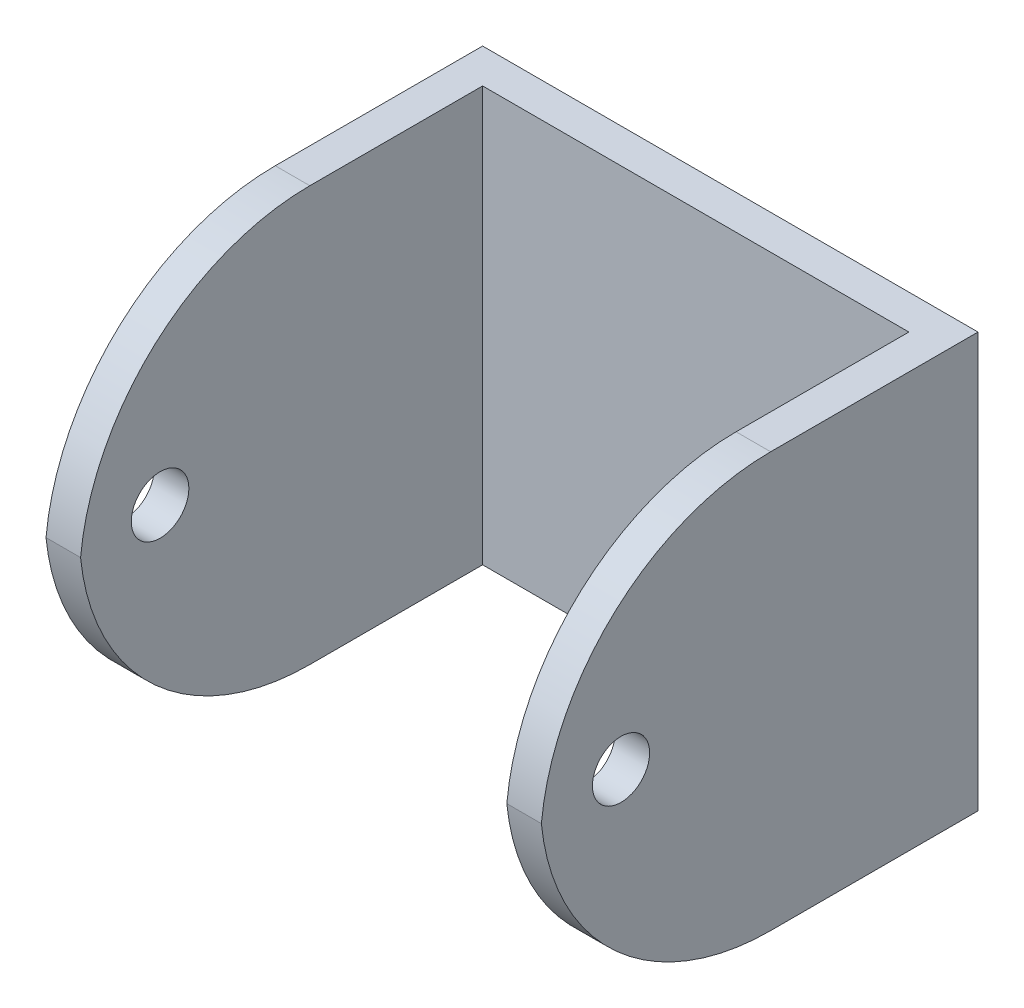
ISO-10303-21;
HEADER;
FILE_DESCRIPTION(('STEP AP214'),'2;1');
FILE_NAME('part.step','',(''),(''),'','','');
FILE_SCHEMA(('AUTOMOTIVE_DESIGN { 1 0 10303 214 1 1 1 1 }'));
ENDSEC;
DATA;
#1=APPLICATION_CONTEXT('core data for automotive mechanical design processes');
#2=APPLICATION_PROTOCOL_DEFINITION('international standard','automotive_design',2000,#1);
#3=PRODUCT_CONTEXT('',#1,'mechanical');
#4=PRODUCT('Part','Part','',(#3));
#5=PRODUCT_RELATED_PRODUCT_CATEGORY('part','',(#4));
#6=PRODUCT_DEFINITION_FORMATION('','',#4);
#7=PRODUCT_DEFINITION_CONTEXT('part definition',#1,'design');
#8=PRODUCT_DEFINITION('design','',#6,#7);
#9=PRODUCT_DEFINITION_SHAPE('','',#8);
#10=(LENGTH_UNIT() NAMED_UNIT(*) SI_UNIT(.MILLI.,.METRE.));
#11=(NAMED_UNIT(*) PLANE_ANGLE_UNIT() SI_UNIT($,.RADIAN.));
#12=(NAMED_UNIT(*) SI_UNIT($,.STERADIAN.) SOLID_ANGLE_UNIT());
#13=UNCERTAINTY_MEASURE_WITH_UNIT(LENGTH_MEASURE(1.E-05),#10,'distance_accuracy_value','');
#14=(GEOMETRIC_REPRESENTATION_CONTEXT(3) GLOBAL_UNCERTAINTY_ASSIGNED_CONTEXT((#13)) GLOBAL_UNIT_ASSIGNED_CONTEXT((#10,
#11,#12)) REPRESENTATION_CONTEXT('',''));
#15=CARTESIAN_POINT('',(0.,0.,0.));
#16=DIRECTION('',(0.,0.,1.));
#17=DIRECTION('',(1.,0.,0.));
#18=AXIS2_PLACEMENT_3D('',#15,#16,#17);
#19=CARTESIAN_POINT('',(-74.0142461928934,-4.40042301184432,3.));
#20=DIRECTION('',(0.,0.,1.));
#21=DIRECTION('',(1.,0.,0.));
#22=AXIS2_PLACEMENT_3D('',#19,#20,#21);
#23=PLANE('',#22);
#24=DIRECTION('',(1.,0.,0.));
#25=VECTOR('',#24,1.);
#26=CARTESIAN_POINT('',(-74.0142461928934,-4.40042301184432,3.));
#27=LINE('',#26,#25);
#28=CARTESIAN_POINT('',(-71.0142461928934,-4.40042301184432,3.));
#29=VERTEX_POINT('',#28);
#30=CARTESIAN_POINT('',(-34.0142461928934,-4.40042301184432,3.));
#31=VERTEX_POINT('',#30);
#32=EDGE_CURVE('E124',#29,#31,#27,.T.);
#33=ORIENTED_EDGE('',*,*,#32,.T.);
#34=DIRECTION('',(0.,-1.,0.));
#35=VECTOR('',#34,1.);
#36=CARTESIAN_POINT('',(-34.0142461928934,31.5995769881557,3.));
#37=LINE('',#36,#35);
#38=CARTESIAN_POINT('',(-34.0142461928934,31.5995769881557,3.));
#39=VERTEX_POINT('',#38);
#40=EDGE_CURVE('E109',#39,#31,#37,.T.);
#41=ORIENTED_EDGE('',*,*,#40,.F.);
#42=DIRECTION('',(-1.,0.,0.));
#43=VECTOR('',#42,1.);
#44=CARTESIAN_POINT('',(-74.0142461928934,31.5995769881557,3.));
#45=LINE('',#44,#43);
#46=CARTESIAN_POINT('',(-71.0142461928934,31.5995769881557,3.));
#47=VERTEX_POINT('',#46);
#48=EDGE_CURVE('E116',#39,#47,#45,.T.);
#49=ORIENTED_EDGE('',*,*,#48,.T.);
#50=DIRECTION('',(0.,1.,0.));
#51=VECTOR('',#50,1.);
#52=CARTESIAN_POINT('',(-71.0142461928934,31.5995769881557,3.));
#53=LINE('',#52,#51);
#54=EDGE_CURVE('E140',#29,#47,#53,.T.);
#55=ORIENTED_EDGE('',*,*,#54,.F.);
#56=EDGE_LOOP('',(#33,#41,#49,#55));
#57=FACE_BOUND('',#56,.T.);
#58=ADVANCED_FACE('F33',(#57),#23,.T.);
#59=CARTESIAN_POINT('',(-74.0142461928934,31.5995769881557,3.));
#60=DIRECTION('',(1.,0.,0.));
#61=DIRECTION('',(0.,1.,0.));
#62=AXIS2_PLACEMENT_3D('',#59,#60,#61);
#63=PLANE('',#62);
#64=CARTESIAN_POINT('',(-74.0142461928934,14.0995769881557,31.));
#65=DIRECTION('',(-1.,0.,0.));
#66=DIRECTION('',(0.,-1.,0.));
#67=AXIS2_PLACEMENT_3D('',#64,#65,#66);
#68=CIRCLE('',#67,2.49999999999999);
#69=CARTESIAN_POINT('',(-74.0142461928934,11.5995769881557,31.));
#70=VERTEX_POINT('',#69);
#71=EDGE_CURVE('E136',#70,#70,#68,.T.);
#72=ORIENTED_EDGE('',*,*,#71,.F.);
#73=EDGE_LOOP('',(#72));
#74=FACE_BOUND('',#73,.T.);
#75=DIRECTION('',(0.,0.,-1.));
#76=VECTOR('',#75,1.);
#77=CARTESIAN_POINT('',(-74.0142461928934,-4.40042301184432,3.));
#78=LINE('',#77,#76);
#79=CARTESIAN_POINT('',(-74.0142461928934,-4.40042301184432,18.));
#80=VERTEX_POINT('',#79);
#81=CARTESIAN_POINT('',(-74.0142461928934,-4.40042301184432,0.));
#82=VERTEX_POINT('',#81);
#83=EDGE_CURVE('E154',#80,#82,#78,.T.);
#84=ORIENTED_EDGE('',*,*,#83,.F.);
#85=CARTESIAN_POINT('',(-74.0142461928934,15.5995769881557,18.));
#86=DIRECTION('',(1.,0.,0.));
#87=DIRECTION('',(0.,1.,0.));
#88=AXIS2_PLACEMENT_3D('',#85,#86,#87);
#89=CIRCLE('',#88,20.);
#90=CARTESIAN_POINT('',(-74.0142461928934,13.5995769881557,37.8997487421324));
#91=VERTEX_POINT('',#90);
#92=EDGE_CURVE('E169',#80,#91,#89,.F.);
#93=ORIENTED_EDGE('',*,*,#92,.T.);
#94=CARTESIAN_POINT('',(-74.0142461928934,11.5995769881557,18.));
#95=DIRECTION('',(1.,0.,0.));
#96=DIRECTION('',(0.,1.,0.));
#97=AXIS2_PLACEMENT_3D('',#94,#95,#96);
#98=CIRCLE('',#97,20.);
#99=CARTESIAN_POINT('',(-74.0142461928934,31.5995769881557,18.));
#100=VERTEX_POINT('',#99);
#101=EDGE_CURVE('E167',#91,#100,#98,.F.);
#102=ORIENTED_EDGE('',*,*,#101,.T.);
#103=DIRECTION('',(0.,0.,-1.));
#104=VECTOR('',#103,1.);
#105=CARTESIAN_POINT('',(-74.0142461928934,31.5995769881557,3.));
#106=LINE('',#105,#104);
#107=CARTESIAN_POINT('',(-74.0142461928934,31.5995769881557,0.));
#108=VERTEX_POINT('',#107);
#109=EDGE_CURVE('E123',#100,#108,#106,.T.);
#110=ORIENTED_EDGE('',*,*,#109,.T.);
#111=DIRECTION('',(0.,-1.,0.));
#112=VECTOR('',#111,1.);
#113=CARTESIAN_POINT('',(-74.0142461928934,31.5995769881557,0.));
#114=LINE('',#113,#112);
#115=EDGE_CURVE('E145',#108,#82,#114,.T.);
#116=ORIENTED_EDGE('',*,*,#115,.T.);
#117=EDGE_LOOP('',(#84,#93,#102,#110,#116));
#118=FACE_BOUND('',#117,.T.);
#119=ADVANCED_FACE('F213',(#74,#118),#63,.F.);
#120=CARTESIAN_POINT('',(-74.0142461928934,-4.40042301184432,3.));
#121=DIRECTION('',(0.,1.,0.));
#122=DIRECTION('',(0.,0.,1.));
#123=AXIS2_PLACEMENT_3D('',#120,#121,#122);
#124=PLANE('',#123);
#125=DIRECTION('',(0.,0.,-1.));
#126=VECTOR('',#125,1.);
#127=CARTESIAN_POINT('',(-31.0142461928934,-4.40042301184432,3.));
#128=LINE('',#127,#126);
#129=CARTESIAN_POINT('',(-31.0142461928934,-4.40042301184432,18.));
#130=VERTEX_POINT('',#129);
#131=CARTESIAN_POINT('',(-31.0142461928934,-4.40042301184432,0.));
#132=VERTEX_POINT('',#131);
#133=EDGE_CURVE('E186',#130,#132,#128,.T.);
#134=ORIENTED_EDGE('',*,*,#133,.F.);
#135=DIRECTION('',(1.,0.,0.));
#136=VECTOR('',#135,1.);
#137=CARTESIAN_POINT('',(-74.0142461928934,-4.40042301184432,18.));
#138=LINE('',#137,#136);
#139=CARTESIAN_POINT('',(-34.0142461928934,-4.40042301184432,18.));
#140=VERTEX_POINT('',#139);
#141=EDGE_CURVE('E177',#130,#140,#138,.F.);
#142=ORIENTED_EDGE('',*,*,#141,.T.);
#143=DIRECTION('',(0.,0.,-1.));
#144=VECTOR('',#143,1.);
#145=CARTESIAN_POINT('',(-34.0142461928934,-4.40042301184432,38.));
#146=LINE('',#145,#144);
#147=EDGE_CURVE('E113',#140,#31,#146,.T.);
#148=ORIENTED_EDGE('',*,*,#147,.T.);
#149=ORIENTED_EDGE('',*,*,#32,.F.);
#150=DIRECTION('',(0.,0.,-1.));
#151=VECTOR('',#150,1.);
#152=CARTESIAN_POINT('',(-71.0142461928934,-4.40042301184432,38.));
#153=LINE('',#152,#151);
#154=CARTESIAN_POINT('',(-71.0142461928934,-4.40042301184432,18.));
#155=VERTEX_POINT('',#154);
#156=EDGE_CURVE('E143',#155,#29,#153,.T.);
#157=ORIENTED_EDGE('',*,*,#156,.F.);
#158=DIRECTION('',(1.,0.,0.));
#159=VECTOR('',#158,1.);
#160=CARTESIAN_POINT('',(-74.0142461928934,-4.40042301184432,18.));
#161=LINE('',#160,#159);
#162=EDGE_CURVE('E158',#155,#80,#161,.F.);
#163=ORIENTED_EDGE('',*,*,#162,.T.);
#164=ORIENTED_EDGE('',*,*,#83,.T.);
#165=DIRECTION('',(1.,0.,0.));
#166=VECTOR('',#165,1.);
#167=CARTESIAN_POINT('',(-74.0142461928934,-4.40042301184432,0.));
#168=LINE('',#167,#166);
#169=EDGE_CURVE('E257',#82,#132,#168,.T.);
#170=ORIENTED_EDGE('',*,*,#169,.T.);
#171=EDGE_LOOP('',(#134,#142,#148,#149,#157,#163,#164,#170));
#172=FACE_BOUND('',#171,.T.);
#173=ADVANCED_FACE('F184',(#172),#124,.F.);
#174=CARTESIAN_POINT('',(-31.0142461928934,31.5995769881557,3.));
#175=DIRECTION('',(-1.,0.,0.));
#176=DIRECTION('',(0.,0.,1.));
#177=AXIS2_PLACEMENT_3D('',#174,#175,#176);
#178=PLANE('',#177);
#179=CARTESIAN_POINT('',(-31.0142461928934,14.2170342769596,30.985935606197));
#180=DIRECTION('',(-1.,0.,0.));
#181=DIRECTION('',(0.,0.,1.));
#182=AXIS2_PLACEMENT_3D('',#179,#180,#181);
#183=CIRCLE('',#182,2.48261524146622);
#184=CARTESIAN_POINT('',(-31.0142461928934,14.2170342769596,33.4685508476632));
#185=VERTEX_POINT('',#184);
#186=EDGE_CURVE('E128',#185,#185,#183,.T.);
#187=ORIENTED_EDGE('',*,*,#186,.T.);
#188=EDGE_LOOP('',(#187));
#189=FACE_BOUND('',#188,.T.);
#190=CARTESIAN_POINT('',(-31.0142461928934,11.5995769881557,18.));
#191=DIRECTION('',(-1.,0.,0.));
#192=DIRECTION('',(0.,0.,1.));
#193=AXIS2_PLACEMENT_3D('',#190,#191,#192);
#194=CIRCLE('',#193,20.);
#195=CARTESIAN_POINT('',(-31.0142461928934,31.5995769881557,18.));
#196=VERTEX_POINT('',#195);
#197=CARTESIAN_POINT('',(-31.0142461928934,13.5995769881557,37.8997487421324));
#198=VERTEX_POINT('',#197);
#199=EDGE_CURVE('E171',#196,#198,#194,.F.);
#200=ORIENTED_EDGE('',*,*,#199,.T.);
#201=CARTESIAN_POINT('',(-31.0142461928934,15.5995769881557,18.));
#202=DIRECTION('',(-1.,0.,0.));
#203=DIRECTION('',(0.,0.,1.));
#204=AXIS2_PLACEMENT_3D('',#201,#202,#203);
#205=CIRCLE('',#204,20.);
#206=EDGE_CURVE('E175',#198,#130,#205,.F.);
#207=ORIENTED_EDGE('',*,*,#206,.T.);
#208=ORIENTED_EDGE('',*,*,#133,.T.);
#209=DIRECTION('',(0.,1.,0.));
#210=VECTOR('',#209,1.);
#211=CARTESIAN_POINT('',(-31.0142461928934,31.5995769881557,0.));
#212=LINE('',#211,#210);
#213=CARTESIAN_POINT('',(-31.0142461928934,31.5995769881557,0.));
#214=VERTEX_POINT('',#213);
#215=EDGE_CURVE('E250',#132,#214,#212,.T.);
#216=ORIENTED_EDGE('',*,*,#215,.T.);
#217=DIRECTION('',(0.,0.,-1.));
#218=VECTOR('',#217,1.);
#219=CARTESIAN_POINT('',(-31.0142461928934,31.5995769881557,3.));
#220=LINE('',#219,#218);
#221=EDGE_CURVE('E246',#196,#214,#220,.T.);
#222=ORIENTED_EDGE('',*,*,#221,.F.);
#223=EDGE_LOOP('',(#200,#207,#208,#216,#222));
#224=FACE_BOUND('',#223,.T.);
#225=ADVANCED_FACE('F229',(#189,#224),#178,.F.);
#226=CARTESIAN_POINT('',(-74.0142461928934,31.5995769881557,3.));
#227=DIRECTION('',(0.,-1.,0.));
#228=DIRECTION('',(0.,0.,-1.));
#229=AXIS2_PLACEMENT_3D('',#226,#227,#228);
#230=PLANE('',#229);
#231=DIRECTION('',(0.,0.,-1.));
#232=VECTOR('',#231,1.);
#233=CARTESIAN_POINT('',(-34.0142461928934,31.5995769881557,38.));
#234=LINE('',#233,#232);
#235=CARTESIAN_POINT('',(-34.0142461928934,31.5995769881557,18.));
#236=VERTEX_POINT('',#235);
#237=EDGE_CURVE('E105',#236,#39,#234,.T.);
#238=ORIENTED_EDGE('',*,*,#237,.F.);
#239=DIRECTION('',(-1.,0.,0.));
#240=VECTOR('',#239,1.);
#241=CARTESIAN_POINT('',(-74.0142461928934,31.5995769881557,18.));
#242=LINE('',#241,#240);
#243=EDGE_CURVE('E11',#236,#196,#242,.F.);
#244=ORIENTED_EDGE('',*,*,#243,.T.);
#245=ORIENTED_EDGE('',*,*,#221,.T.);
#246=DIRECTION('',(-1.,0.,0.));
#247=VECTOR('',#246,1.);
#248=CARTESIAN_POINT('',(-74.0142461928934,31.5995769881557,0.));
#249=LINE('',#248,#247);
#250=EDGE_CURVE('E153',#214,#108,#249,.T.);
#251=ORIENTED_EDGE('',*,*,#250,.T.);
#252=ORIENTED_EDGE('',*,*,#109,.F.);
#253=DIRECTION('',(-1.,0.,0.));
#254=VECTOR('',#253,1.);
#255=CARTESIAN_POINT('',(-71.0142461928934,31.5995769881557,18.));
#256=LINE('',#255,#254);
#257=CARTESIAN_POINT('',(-71.0142461928934,31.5995769881557,18.));
#258=VERTEX_POINT('',#257);
#259=EDGE_CURVE('E161',#100,#258,#256,.F.);
#260=ORIENTED_EDGE('',*,*,#259,.T.);
#261=DIRECTION('',(0.,0.,-1.));
#262=VECTOR('',#261,1.);
#263=CARTESIAN_POINT('',(-71.0142461928934,31.5995769881557,38.));
#264=LINE('',#263,#262);
#265=EDGE_CURVE('E119',#258,#47,#264,.T.);
#266=ORIENTED_EDGE('',*,*,#265,.T.);
#267=ORIENTED_EDGE('',*,*,#48,.F.);
#268=EDGE_LOOP('',(#238,#244,#245,#251,#252,#260,#266,#267));
#269=FACE_BOUND('',#268,.T.);
#270=ADVANCED_FACE('F117',(#269),#230,.F.);
#271=CARTESIAN_POINT('',(-74.0142461928934,-4.40042301184432,0.));
#272=DIRECTION('',(0.,0.,1.));
#273=DIRECTION('',(1.,0.,0.));
#274=AXIS2_PLACEMENT_3D('',#271,#272,#273);
#275=PLANE('',#274);
#276=ORIENTED_EDGE('',*,*,#115,.F.);
#277=ORIENTED_EDGE('',*,*,#250,.F.);
#278=ORIENTED_EDGE('',*,*,#215,.F.);
#279=ORIENTED_EDGE('',*,*,#169,.F.);
#280=EDGE_LOOP('',(#276,#277,#278,#279));
#281=FACE_BOUND('',#280,.T.);
#282=ADVANCED_FACE('F223',(#281),#275,.F.);
#283=CARTESIAN_POINT('',(-71.0142461928934,31.5995769881557,38.));
#284=DIRECTION('',(-1.,0.,0.));
#285=DIRECTION('',(0.,0.,1.));
#286=AXIS2_PLACEMENT_3D('',#283,#284,#285);
#287=PLANE('',#286);
#288=CARTESIAN_POINT('',(-71.0142461928934,14.0995769881557,31.));
#289=DIRECTION('',(-1.,0.,0.));
#290=DIRECTION('',(0.,0.,1.));
#291=AXIS2_PLACEMENT_3D('',#288,#289,#290);
#292=CIRCLE('',#291,2.49999999999999);
#293=CARTESIAN_POINT('',(-71.0142461928934,11.5995769881557,31.));
#294=VERTEX_POINT('',#293);
#295=EDGE_CURVE('E139',#294,#294,#292,.T.);
#296=ORIENTED_EDGE('',*,*,#295,.T.);
#297=EDGE_LOOP('',(#296));
#298=FACE_BOUND('',#297,.T.);
#299=CARTESIAN_POINT('',(-71.0142461928934,11.5995769881557,18.));
#300=DIRECTION('',(-1.,0.,0.));
#301=DIRECTION('',(0.,0.,1.));
#302=AXIS2_PLACEMENT_3D('',#299,#300,#301);
#303=CIRCLE('',#302,20.);
#304=CARTESIAN_POINT('',(-71.0142461928934,13.5995769881557,37.8997487421324));
#305=VERTEX_POINT('',#304);
#306=EDGE_CURVE('E163',#258,#305,#303,.F.);
#307=ORIENTED_EDGE('',*,*,#306,.T.);
#308=CARTESIAN_POINT('',(-71.0142461928934,15.5995769881557,18.));
#309=DIRECTION('',(-1.,0.,0.));
#310=DIRECTION('',(0.,0.,1.));
#311=AXIS2_PLACEMENT_3D('',#308,#309,#310);
#312=CIRCLE('',#311,20.);
#313=EDGE_CURVE('E165',#305,#155,#312,.F.);
#314=ORIENTED_EDGE('',*,*,#313,.T.);
#315=ORIENTED_EDGE('',*,*,#156,.T.);
#316=ORIENTED_EDGE('',*,*,#54,.T.);
#317=ORIENTED_EDGE('',*,*,#265,.F.);
#318=EDGE_LOOP('',(#307,#314,#315,#316,#317));
#319=FACE_BOUND('',#318,.T.);
#320=ADVANCED_FACE('F222',(#298,#319),#287,.F.);
#321=CARTESIAN_POINT('',(20.9857538071066,14.0995769881557,31.));
#322=DIRECTION('',(-1.,0.,0.));
#323=DIRECTION('',(0.,-1.,0.));
#324=AXIS2_PLACEMENT_3D('',#321,#322,#323);
#325=CYLINDRICAL_SURFACE('',#324,2.49999999999999);
#326=CARTESIAN_POINT('',(-74.0142461928934,11.5995769881557,31.));
#327=CARTESIAN_POINT('',(-73.9829961928934,11.5995769881557,31.));
#328=CARTESIAN_POINT('',(-73.9517461928934,11.5995769881557,31.));
#329=CARTESIAN_POINT('',(-73.8892461928934,11.5995769881557,31.));
#330=CARTESIAN_POINT('',(-73.8579961928934,11.5995769881557,31.));
#331=CARTESIAN_POINT('',(-73.7954961928934,11.5995769881557,31.));
#332=CARTESIAN_POINT('',(-73.7642461928934,11.5995769881557,31.));
#333=CARTESIAN_POINT('',(-73.7017461928934,11.5995769881557,31.));
#334=CARTESIAN_POINT('',(-73.6704961928934,11.5995769881557,31.));
#335=CARTESIAN_POINT('',(-73.6079961928934,11.5995769881557,31.));
#336=CARTESIAN_POINT('',(-73.5767461928934,11.5995769881557,31.));
#337=CARTESIAN_POINT('',(-73.5142461928934,11.5995769881557,31.));
#338=CARTESIAN_POINT('',(-73.4829961928934,11.5995769881557,31.));
#339=CARTESIAN_POINT('',(-73.4204961928934,11.5995769881557,31.));
#340=CARTESIAN_POINT('',(-73.3892461928934,11.5995769881557,31.));
#341=CARTESIAN_POINT('',(-73.3267461928934,11.5995769881557,31.));
#342=CARTESIAN_POINT('',(-73.2954961928934,11.5995769881557,31.));
#343=CARTESIAN_POINT('',(-73.2329961928934,11.5995769881557,31.));
#344=CARTESIAN_POINT('',(-73.2017461928934,11.5995769881557,31.));
#345=CARTESIAN_POINT('',(-73.1392461928934,11.5995769881557,31.));
#346=CARTESIAN_POINT('',(-73.1079961928934,11.5995769881557,31.));
#347=CARTESIAN_POINT('',(-73.0454961928934,11.5995769881557,31.));
#348=CARTESIAN_POINT('',(-73.0142461928934,11.5995769881557,31.));
#349=CARTESIAN_POINT('',(-72.9517461928934,11.5995769881557,31.));
#350=CARTESIAN_POINT('',(-72.9204961928934,11.5995769881557,31.));
#351=CARTESIAN_POINT('',(-72.8579961928934,11.5995769881557,31.));
#352=CARTESIAN_POINT('',(-72.8267461928934,11.5995769881557,31.));
#353=CARTESIAN_POINT('',(-72.7642461928934,11.5995769881557,31.));
#354=CARTESIAN_POINT('',(-72.7329961928934,11.5995769881557,31.));
#355=CARTESIAN_POINT('',(-72.6704961928934,11.5995769881557,31.));
#356=CARTESIAN_POINT('',(-72.6392461928934,11.5995769881557,31.));
#357=CARTESIAN_POINT('',(-72.5767461928934,11.5995769881557,31.));
#358=CARTESIAN_POINT('',(-72.5454961928934,11.5995769881557,31.));
#359=CARTESIAN_POINT('',(-72.4829961928934,11.5995769881557,31.));
#360=CARTESIAN_POINT('',(-72.4517461928934,11.5995769881557,31.));
#361=CARTESIAN_POINT('',(-72.3892461928934,11.5995769881557,31.));
#362=CARTESIAN_POINT('',(-72.3579961928934,11.5995769881557,31.));
#363=CARTESIAN_POINT('',(-72.2954961928934,11.5995769881557,31.));
#364=CARTESIAN_POINT('',(-72.2642461928934,11.5995769881557,31.));
#365=CARTESIAN_POINT('',(-72.2017461928934,11.5995769881557,31.));
#366=CARTESIAN_POINT('',(-72.1704961928934,11.5995769881557,31.));
#367=CARTESIAN_POINT('',(-72.1079961928934,11.5995769881557,31.));
#368=CARTESIAN_POINT('',(-72.0767461928934,11.5995769881557,31.));
#369=CARTESIAN_POINT('',(-72.0142461928934,11.5995769881557,31.));
#370=CARTESIAN_POINT('',(-71.9829961928934,11.5995769881557,31.));
#371=CARTESIAN_POINT('',(-71.9204961928934,11.5995769881557,31.));
#372=CARTESIAN_POINT('',(-71.8892461928934,11.5995769881557,31.));
#373=CARTESIAN_POINT('',(-71.8267461928934,11.5995769881557,31.));
#374=CARTESIAN_POINT('',(-71.7954961928934,11.5995769881557,31.));
#375=CARTESIAN_POINT('',(-71.7329961928934,11.5995769881557,31.));
#376=CARTESIAN_POINT('',(-71.7017461928934,11.5995769881557,31.));
#377=CARTESIAN_POINT('',(-71.6392461928934,11.5995769881557,31.));
#378=CARTESIAN_POINT('',(-71.6079961928934,11.5995769881557,31.));
#379=CARTESIAN_POINT('',(-71.5454961928934,11.5995769881557,31.));
#380=CARTESIAN_POINT('',(-71.5142461928934,11.5995769881557,31.));
#381=CARTESIAN_POINT('',(-71.4517461928934,11.5995769881557,31.));
#382=CARTESIAN_POINT('',(-71.4204961928934,11.5995769881557,31.));
#383=CARTESIAN_POINT('',(-71.3579961928934,11.5995769881557,31.));
#384=CARTESIAN_POINT('',(-71.3267461928934,11.5995769881557,31.));
#385=CARTESIAN_POINT('',(-71.2642461928934,11.5995769881557,31.));
#386=CARTESIAN_POINT('',(-71.2329961928934,11.5995769881557,31.));
#387=CARTESIAN_POINT('',(-71.1704961928934,11.5995769881557,31.));
#388=CARTESIAN_POINT('',(-71.1392461928934,11.5995769881557,31.));
#389=CARTESIAN_POINT('',(-71.0767461928934,11.5995769881557,31.));
#390=CARTESIAN_POINT('',(-71.0454961928934,11.5995769881557,31.));
#391=CARTESIAN_POINT('',(-71.0142461928934,11.5995769881557,31.));
#392=B_SPLINE_CURVE_WITH_KNOTS('',3,(#326,#327,#328,#329,#330,#331,#332,#333,#334,#335,#336,
#337,#338,#339,#340,#341,#342,#343,#344,#345,#346,#347,#348,#349,#350,#351,#352,#353,#354,#355,
#356,#357,#358,#359,#360,#361,#362,#363,#364,#365,#366,#367,#368,#369,#370,#371,#372,#373,#374,
#375,#376,#377,#378,#379,#380,#381,#382,#383,#384,#385,#386,#387,#388,#389,#390,#391),
.UNSPECIFIED.,.F.,.F.,(4,2,2,2,2,2,2,2,2,2,2,2,2,2,2,2,2,2,2,2,2,2,2,2,2,2,2,2,2,2,2,2,4),(0.,
0.0937500000000036,0.187500000000007,0.281249999999997,0.375,0.468750000000004,
0.562499999999994,0.656249999999997,0.750000000000001,0.843750000000004,0.937500000000008,
1.03125,1.125,1.21875,1.31249999999999,1.40625,1.5,1.59375,1.68750000000001,1.78125,1.875,
1.96875000000001,2.06249999999999,2.15625,2.25,2.34375000000001,2.43750000000001,2.53125,2.625,
2.71875000000001,2.8125,2.90625,3.),.UNSPECIFIED.);
#393=EDGE_CURVE('BSEAM236',#70,#294,#392,.T.);
#394=ORIENTED_EDGE('',*,*,#71,.T.);
#395=ORIENTED_EDGE('',*,*,#295,.F.);
#396=ORIENTED_EDGE('',*,*,#393,.T.);
#397=ORIENTED_EDGE('',*,*,#393,.F.);
#398=EDGE_LOOP('',(#394,#396,#395,#397));
#399=FACE_BOUND('',#398,.T.);
#400=ADVANCED_FACE('F236',(#399),#325,.F.);
#401=CARTESIAN_POINT('',(-74.0142461928934,11.5995769881557,18.));
#402=DIRECTION('',(1.,0.,0.));
#403=DIRECTION('',(0.,0.,-1.));
#404=AXIS2_PLACEMENT_3D('',#401,#402,#403);
#405=CYLINDRICAL_SURFACE('',#404,20.);
#406=ORIENTED_EDGE('',*,*,#259,.F.);
#407=ORIENTED_EDGE('',*,*,#101,.F.);
#408=DIRECTION('',(1.,0.,0.));
#409=VECTOR('',#408,1.);
#410=CARTESIAN_POINT('',(-72.5142461928934,13.5995769881557,37.8997487421324));
#411=LINE('',#410,#409);
#412=EDGE_CURVE('E112',#305,#91,#411,.F.);
#413=ORIENTED_EDGE('',*,*,#412,.F.);
#414=ORIENTED_EDGE('',*,*,#306,.F.);
#415=EDGE_LOOP('',(#406,#407,#413,#414));
#416=FACE_BOUND('',#415,.T.);
#417=ADVANCED_FACE('F208',(#416),#405,.T.);
#418=CARTESIAN_POINT('',(-74.0142461928934,15.5995769881557,18.));
#419=DIRECTION('',(-1.,0.,0.));
#420=DIRECTION('',(0.,0.,1.));
#421=AXIS2_PLACEMENT_3D('',#418,#419,#420);
#422=CYLINDRICAL_SURFACE('',#421,20.);
#423=ORIENTED_EDGE('',*,*,#92,.F.);
#424=ORIENTED_EDGE('',*,*,#162,.F.);
#425=ORIENTED_EDGE('',*,*,#313,.F.);
#426=ORIENTED_EDGE('',*,*,#412,.T.);
#427=EDGE_LOOP('',(#423,#424,#425,#426));
#428=FACE_BOUND('',#427,.T.);
#429=ADVANCED_FACE('F201',(#428),#422,.T.);
#430=CARTESIAN_POINT('',(-34.0142461928934,31.5995769881557,38.));
#431=DIRECTION('',(1.,0.,0.));
#432=DIRECTION('',(0.,0.,-1.));
#433=AXIS2_PLACEMENT_3D('',#430,#431,#432);
#434=PLANE('',#433);
#435=CARTESIAN_POINT('',(-34.0142461928934,14.2170342769596,30.985935606197));
#436=DIRECTION('',(-1.,0.,0.));
#437=DIRECTION('',(0.,0.,1.));
#438=AXIS2_PLACEMENT_3D('',#435,#436,#437);
#439=CIRCLE('',#438,2.48261524146622);
#440=CARTESIAN_POINT('',(-34.0142461928934,14.2170342769596,33.4685508476632));
#441=VERTEX_POINT('',#440);
#442=EDGE_CURVE('E132',#441,#441,#439,.T.);
#443=ORIENTED_EDGE('',*,*,#442,.F.);
#444=EDGE_LOOP('',(#443));
#445=FACE_BOUND('',#444,.T.);
#446=ORIENTED_EDGE('',*,*,#147,.F.);
#447=CARTESIAN_POINT('',(-34.0142461928934,15.5995769881557,18.));
#448=DIRECTION('',(1.,0.,0.));
#449=DIRECTION('',(0.,0.,-1.));
#450=AXIS2_PLACEMENT_3D('',#447,#448,#449);
#451=CIRCLE('',#450,20.);
#452=CARTESIAN_POINT('',(-34.0142461928934,13.5995769881557,37.8997487421324));
#453=VERTEX_POINT('',#452);
#454=EDGE_CURVE('E42',#140,#453,#451,.F.);
#455=ORIENTED_EDGE('',*,*,#454,.T.);
#456=CARTESIAN_POINT('',(-34.0142461928934,11.5995769881557,18.));
#457=DIRECTION('',(1.,0.,0.));
#458=DIRECTION('',(0.,0.,-1.));
#459=AXIS2_PLACEMENT_3D('',#456,#457,#458);
#460=CIRCLE('',#459,20.);
#461=EDGE_CURVE('E52',#453,#236,#460,.F.);
#462=ORIENTED_EDGE('',*,*,#461,.T.);
#463=ORIENTED_EDGE('',*,*,#237,.T.);
#464=ORIENTED_EDGE('',*,*,#40,.T.);
#465=EDGE_LOOP('',(#446,#455,#462,#463,#464));
#466=FACE_BOUND('',#465,.T.);
#467=ADVANCED_FACE('F107',(#445,#466),#434,.F.);
#468=CARTESIAN_POINT('',(0.985753807106631,14.2170342769596,30.985935606197));
#469=DIRECTION('',(-1.,0.,0.));
#470=DIRECTION('',(0.,0.,1.));
#471=AXIS2_PLACEMENT_3D('',#468,#469,#470);
#472=CYLINDRICAL_SURFACE('',#471,2.48261524146622);
#473=ORIENTED_EDGE('',*,*,#442,.T.);
#474=EDGE_LOOP('',(#473));
#475=FACE_BOUND('',#474,.T.);
#476=ORIENTED_EDGE('',*,*,#186,.F.);
#477=EDGE_LOOP('',(#476));
#478=FACE_BOUND('',#477,.T.);
#479=ADVANCED_FACE('F197',(#475,#478),#472,.F.);
#480=CARTESIAN_POINT('',(-31.0142461928934,11.5995769881557,18.));
#481=DIRECTION('',(-1.,0.,0.));
#482=DIRECTION('',(0.,0.,1.));
#483=AXIS2_PLACEMENT_3D('',#480,#481,#482);
#484=CYLINDRICAL_SURFACE('',#483,20.);
#485=ORIENTED_EDGE('',*,*,#243,.F.);
#486=ORIENTED_EDGE('',*,*,#461,.F.);
#487=DIRECTION('',(-1.,0.,0.));
#488=VECTOR('',#487,1.);
#489=CARTESIAN_POINT('',(-32.5142461928934,13.5995769881557,37.8997487421324));
#490=LINE('',#489,#488);
#491=EDGE_CURVE('E37',#198,#453,#490,.T.);
#492=ORIENTED_EDGE('',*,*,#491,.F.);
#493=ORIENTED_EDGE('',*,*,#199,.F.);
#494=EDGE_LOOP('',(#485,#486,#492,#493));
#495=FACE_BOUND('',#494,.T.);
#496=ADVANCED_FACE('F35',(#495),#484,.T.);
#497=CARTESIAN_POINT('',(-31.0142461928934,15.5995769881557,18.));
#498=DIRECTION('',(1.,0.,0.));
#499=DIRECTION('',(0.,0.,-1.));
#500=AXIS2_PLACEMENT_3D('',#497,#498,#499);
#501=CYLINDRICAL_SURFACE('',#500,20.);
#502=ORIENTED_EDGE('',*,*,#454,.F.);
#503=ORIENTED_EDGE('',*,*,#141,.F.);
#504=ORIENTED_EDGE('',*,*,#206,.F.);
#505=ORIENTED_EDGE('',*,*,#491,.T.);
#506=EDGE_LOOP('',(#502,#503,#504,#505));
#507=FACE_BOUND('',#506,.T.);
#508=ADVANCED_FACE('F189',(#507),#501,.T.);
#509=CLOSED_SHELL('',(#58,#119,#173,#225,#270,#282,#320,#400,#417,#429,#467,#479,#496,#508));
#510=MANIFOLD_SOLID_BREP('B2',#509);
#511=ADVANCED_BREP_SHAPE_REPRESENTATION('',(#18,#510),#14);
#512=SHAPE_DEFINITION_REPRESENTATION(#9,#511);
ENDSEC;
END-ISO-10303-21;
